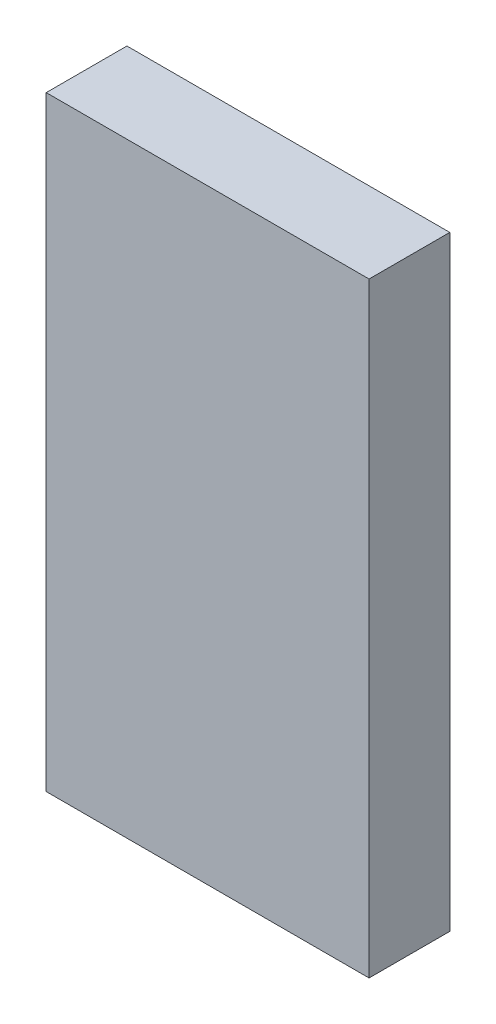
ISO-10303-21;
HEADER;
FILE_DESCRIPTION(('STEP AP214'),'2;1');
FILE_NAME('part.step','',(''),(''),'','','');
FILE_SCHEMA(('AUTOMOTIVE_DESIGN { 1 0 10303 214 1 1 1 1 }'));
ENDSEC;
DATA;
#1=APPLICATION_CONTEXT('core data for automotive mechanical design processes');
#2=APPLICATION_PROTOCOL_DEFINITION('international standard','automotive_design',2000,#1);
#3=PRODUCT_CONTEXT('',#1,'mechanical');
#4=PRODUCT('Part','Part','',(#3));
#5=PRODUCT_RELATED_PRODUCT_CATEGORY('part','',(#4));
#6=PRODUCT_DEFINITION_FORMATION('','',#4);
#7=PRODUCT_DEFINITION_CONTEXT('part definition',#1,'design');
#8=PRODUCT_DEFINITION('design','',#6,#7);
#9=PRODUCT_DEFINITION_SHAPE('','',#8);
#10=(LENGTH_UNIT() NAMED_UNIT(*) SI_UNIT(.MILLI.,.METRE.));
#11=(NAMED_UNIT(*) PLANE_ANGLE_UNIT() SI_UNIT($,.RADIAN.));
#12=(NAMED_UNIT(*) SI_UNIT($,.STERADIAN.) SOLID_ANGLE_UNIT());
#13=UNCERTAINTY_MEASURE_WITH_UNIT(LENGTH_MEASURE(1.E-05),#10,'distance_accuracy_value','');
#14=(GEOMETRIC_REPRESENTATION_CONTEXT(3) GLOBAL_UNCERTAINTY_ASSIGNED_CONTEXT((#13)) GLOBAL_UNIT_ASSIGNED_CONTEXT((#10,
#11,#12)) REPRESENTATION_CONTEXT('',''));
#15=CARTESIAN_POINT('',(0.,0.,0.));
#16=DIRECTION('',(0.,0.,1.));
#17=DIRECTION('',(1.,0.,0.));
#18=AXIS2_PLACEMENT_3D('',#15,#16,#17);
#19=CARTESIAN_POINT('',(4.,-7.5,1.));
#20=DIRECTION('',(-1.,0.,0.));
#21=DIRECTION('',(0.,0.,1.));
#22=AXIS2_PLACEMENT_3D('',#19,#20,#21);
#23=PLANE('',#22);
#24=DIRECTION('',(0.,1.,0.));
#25=VECTOR('',#24,1.);
#26=CARTESIAN_POINT('',(4.,-7.5,-1.));
#27=LINE('',#26,#25);
#28=CARTESIAN_POINT('',(4.,-7.5,-1.));
#29=VERTEX_POINT('',#28);
#30=CARTESIAN_POINT('',(4.,7.5,-1.));
#31=VERTEX_POINT('',#30);
#32=EDGE_CURVE('E111',#29,#31,#27,.T.);
#33=ORIENTED_EDGE('',*,*,#32,.T.);
#34=DIRECTION('',(0.,0.,-1.));
#35=VECTOR('',#34,1.);
#36=CARTESIAN_POINT('',(4.,7.5,1.));
#37=LINE('',#36,#35);
#38=CARTESIAN_POINT('',(4.,7.5,1.));
#39=VERTEX_POINT('',#38);
#40=EDGE_CURVE('E11',#39,#31,#37,.T.);
#41=ORIENTED_EDGE('',*,*,#40,.F.);
#42=DIRECTION('',(0.,1.,0.));
#43=VECTOR('',#42,1.);
#44=CARTESIAN_POINT('',(4.,-7.5,1.));
#45=LINE('',#44,#43);
#46=CARTESIAN_POINT('',(4.,-7.5,1.));
#47=VERTEX_POINT('',#46);
#48=EDGE_CURVE('E95',#47,#39,#45,.T.);
#49=ORIENTED_EDGE('',*,*,#48,.F.);
#50=DIRECTION('',(0.,0.,-1.));
#51=VECTOR('',#50,1.);
#52=CARTESIAN_POINT('',(4.,-7.5,1.));
#53=LINE('',#52,#51);
#54=EDGE_CURVE('E107',#47,#29,#53,.T.);
#55=ORIENTED_EDGE('',*,*,#54,.T.);
#56=EDGE_LOOP('',(#33,#41,#49,#55));
#57=FACE_BOUND('',#56,.T.);
#58=ADVANCED_FACE('F43',(#57),#23,.F.);
#59=CARTESIAN_POINT('',(-4.,7.5,1.));
#60=DIRECTION('',(0.,-1.,0.));
#61=DIRECTION('',(0.,0.,-1.));
#62=AXIS2_PLACEMENT_3D('',#59,#60,#61);
#63=PLANE('',#62);
#64=DIRECTION('',(-1.,0.,0.));
#65=VECTOR('',#64,1.);
#66=CARTESIAN_POINT('',(-4.,7.5,-1.));
#67=LINE('',#66,#65);
#68=CARTESIAN_POINT('',(-4.,7.5,-1.));
#69=VERTEX_POINT('',#68);
#70=EDGE_CURVE('E100',#31,#69,#67,.T.);
#71=ORIENTED_EDGE('',*,*,#70,.T.);
#72=DIRECTION('',(0.,0.,-1.));
#73=VECTOR('',#72,1.);
#74=CARTESIAN_POINT('',(-4.,7.5,1.));
#75=LINE('',#74,#73);
#76=CARTESIAN_POINT('',(-4.,7.5,1.));
#77=VERTEX_POINT('',#76);
#78=EDGE_CURVE('E52',#77,#69,#75,.T.);
#79=ORIENTED_EDGE('',*,*,#78,.F.);
#80=DIRECTION('',(-1.,0.,0.));
#81=VECTOR('',#80,1.);
#82=CARTESIAN_POINT('',(-4.,7.5,1.));
#83=LINE('',#82,#81);
#84=EDGE_CURVE('E90',#39,#77,#83,.T.);
#85=ORIENTED_EDGE('',*,*,#84,.F.);
#86=ORIENTED_EDGE('',*,*,#40,.T.);
#87=EDGE_LOOP('',(#71,#79,#85,#86));
#88=FACE_BOUND('',#87,.T.);
#89=ADVANCED_FACE('F99',(#88),#63,.F.);
#90=CARTESIAN_POINT('',(-4.,-7.5,1.));
#91=DIRECTION('',(1.,0.,0.));
#92=DIRECTION('',(0.,0.,-1.));
#93=AXIS2_PLACEMENT_3D('',#90,#91,#92);
#94=PLANE('',#93);
#95=DIRECTION('',(0.,-1.,0.));
#96=VECTOR('',#95,1.);
#97=CARTESIAN_POINT('',(-4.,-7.5,-1.));
#98=LINE('',#97,#96);
#99=CARTESIAN_POINT('',(-4.,-7.5,-1.));
#100=VERTEX_POINT('',#99);
#101=EDGE_CURVE('E77',#69,#100,#98,.T.);
#102=ORIENTED_EDGE('',*,*,#101,.T.);
#103=DIRECTION('',(0.,0.,-1.));
#104=VECTOR('',#103,1.);
#105=CARTESIAN_POINT('',(-4.,-7.5,1.));
#106=LINE('',#105,#104);
#107=CARTESIAN_POINT('',(-4.,-7.5,1.));
#108=VERTEX_POINT('',#107);
#109=EDGE_CURVE('E102',#108,#100,#106,.T.);
#110=ORIENTED_EDGE('',*,*,#109,.F.);
#111=DIRECTION('',(0.,-1.,0.));
#112=VECTOR('',#111,1.);
#113=CARTESIAN_POINT('',(-4.,-7.5,1.));
#114=LINE('',#113,#112);
#115=EDGE_CURVE('E93',#77,#108,#114,.T.);
#116=ORIENTED_EDGE('',*,*,#115,.F.);
#117=ORIENTED_EDGE('',*,*,#78,.T.);
#118=EDGE_LOOP('',(#102,#110,#116,#117));
#119=FACE_BOUND('',#118,.T.);
#120=ADVANCED_FACE('F103',(#119),#94,.F.);
#121=CARTESIAN_POINT('',(-4.,-7.5,1.));
#122=DIRECTION('',(0.,1.,0.));
#123=DIRECTION('',(0.,0.,1.));
#124=AXIS2_PLACEMENT_3D('',#121,#122,#123);
#125=PLANE('',#124);
#126=DIRECTION('',(1.,0.,0.));
#127=VECTOR('',#126,1.);
#128=CARTESIAN_POINT('',(-4.,-7.5,-1.));
#129=LINE('',#128,#127);
#130=EDGE_CURVE('E83',#100,#29,#129,.T.);
#131=ORIENTED_EDGE('',*,*,#130,.T.);
#132=ORIENTED_EDGE('',*,*,#54,.F.);
#133=DIRECTION('',(1.,0.,0.));
#134=VECTOR('',#133,1.);
#135=CARTESIAN_POINT('',(-4.,-7.5,1.));
#136=LINE('',#135,#134);
#137=EDGE_CURVE('E60',#108,#47,#136,.T.);
#138=ORIENTED_EDGE('',*,*,#137,.F.);
#139=ORIENTED_EDGE('',*,*,#109,.T.);
#140=EDGE_LOOP('',(#131,#132,#138,#139));
#141=FACE_BOUND('',#140,.T.);
#142=ADVANCED_FACE('F125',(#141),#125,.F.);
#143=CARTESIAN_POINT('',(0.,0.,1.));
#144=DIRECTION('',(0.,0.,-1.));
#145=DIRECTION('',(-1.,0.,0.));
#146=AXIS2_PLACEMENT_3D('',#143,#144,#145);
#147=PLANE('',#146);
#148=ORIENTED_EDGE('',*,*,#48,.T.);
#149=ORIENTED_EDGE('',*,*,#84,.T.);
#150=ORIENTED_EDGE('',*,*,#115,.T.);
#151=ORIENTED_EDGE('',*,*,#137,.T.);
#152=EDGE_LOOP('',(#148,#149,#150,#151));
#153=FACE_BOUND('',#152,.T.);
#154=ADVANCED_FACE('F91',(#153),#147,.F.);
#155=CARTESIAN_POINT('',(0.,0.,-1.));
#156=DIRECTION('',(0.,0.,-1.));
#157=DIRECTION('',(-1.,0.,0.));
#158=AXIS2_PLACEMENT_3D('',#155,#156,#157);
#159=PLANE('',#158);
#160=CARTESIAN_POINT('',(0.,6.,-1.));
#161=DIRECTION('',(0.,0.,-1.));
#162=DIRECTION('',(-1.,0.,0.));
#163=AXIS2_PLACEMENT_3D('',#160,#161,#162);
#164=CIRCLE('',#163,1.);
#165=CARTESIAN_POINT('',(-1.,6.,-1.));
#166=VERTEX_POINT('',#165);
#167=EDGE_CURVE('E140',#166,#166,#164,.T.);
#168=ORIENTED_EDGE('',*,*,#167,.F.);
#169=EDGE_LOOP('',(#168));
#170=FACE_BOUND('',#169,.T.);
#171=CARTESIAN_POINT('',(0.,-6.,-1.));
#172=DIRECTION('',(0.,0.,-1.));
#173=DIRECTION('',(1.,0.,0.));
#174=AXIS2_PLACEMENT_3D('',#171,#172,#173);
#175=CIRCLE('',#174,1.);
#176=CARTESIAN_POINT('',(1.,-6.,-1.));
#177=VERTEX_POINT('',#176);
#178=EDGE_CURVE('E136',#177,#177,#175,.T.);
#179=ORIENTED_EDGE('',*,*,#178,.F.);
#180=EDGE_LOOP('',(#179));
#181=FACE_BOUND('',#180,.T.);
#182=ORIENTED_EDGE('',*,*,#32,.F.);
#183=ORIENTED_EDGE('',*,*,#130,.F.);
#184=ORIENTED_EDGE('',*,*,#101,.F.);
#185=ORIENTED_EDGE('',*,*,#70,.F.);
#186=EDGE_LOOP('',(#182,#183,#184,#185));
#187=FACE_BOUND('',#186,.T.);
#188=ADVANCED_FACE('F128',(#170,#181,#187),#159,.T.);
#189=CARTESIAN_POINT('',(0.,-6.,0.));
#190=DIRECTION('',(0.,0.,-1.));
#191=DIRECTION('',(-1.,0.,0.));
#192=AXIS2_PLACEMENT_3D('',#189,#190,#191);
#193=CYLINDRICAL_SURFACE('',#192,1.);
#194=CARTESIAN_POINT('',(0.,-6.,0.));
#195=DIRECTION('',(0.,0.,-1.));
#196=DIRECTION('',(1.,0.,0.));
#197=AXIS2_PLACEMENT_3D('',#194,#195,#196);
#198=CIRCLE('',#197,1.);
#199=CARTESIAN_POINT('',(1.,-6.,0.));
#200=VERTEX_POINT('',#199);
#201=EDGE_CURVE('E132',#200,#200,#198,.T.);
#202=ORIENTED_EDGE('',*,*,#201,.F.);
#203=EDGE_LOOP('',(#202));
#204=FACE_BOUND('',#203,.T.);
#205=ORIENTED_EDGE('',*,*,#178,.T.);
#206=EDGE_LOOP('',(#205));
#207=FACE_BOUND('',#206,.T.);
#208=ADVANCED_FACE('F159',(#204,#207),#193,.F.);
#209=CARTESIAN_POINT('',(0.,-6.,0.));
#210=DIRECTION('',(0.,0.,1.));
#211=DIRECTION('',(1.,0.,0.));
#212=AXIS2_PLACEMENT_3D('',#209,#210,#211);
#213=PLANE('',#212);
#214=ORIENTED_EDGE('',*,*,#201,.T.);
#215=EDGE_LOOP('',(#214));
#216=FACE_BOUND('',#215,.T.);
#217=ADVANCED_FACE('F153',(#216),#213,.F.);
#218=CARTESIAN_POINT('',(0.,6.,0.));
#219=DIRECTION('',(0.,0.,-1.));
#220=DIRECTION('',(-1.,0.,0.));
#221=AXIS2_PLACEMENT_3D('',#218,#219,#220);
#222=CYLINDRICAL_SURFACE('',#221,1.);
#223=CARTESIAN_POINT('',(0.,6.,0.));
#224=DIRECTION('',(0.,0.,-1.));
#225=DIRECTION('',(-1.,0.,0.));
#226=AXIS2_PLACEMENT_3D('',#223,#224,#225);
#227=CIRCLE('',#226,1.);
#228=CARTESIAN_POINT('',(-1.,6.,0.));
#229=VERTEX_POINT('',#228);
#230=EDGE_CURVE('E115',#229,#229,#227,.T.);
#231=ORIENTED_EDGE('',*,*,#230,.F.);
#232=EDGE_LOOP('',(#231));
#233=FACE_BOUND('',#232,.T.);
#234=ORIENTED_EDGE('',*,*,#167,.T.);
#235=EDGE_LOOP('',(#234));
#236=FACE_BOUND('',#235,.T.);
#237=ADVANCED_FACE('F150',(#233,#236),#222,.F.);
#238=CARTESIAN_POINT('',(0.,6.,0.));
#239=DIRECTION('',(0.,0.,-1.));
#240=DIRECTION('',(-1.,0.,0.));
#241=AXIS2_PLACEMENT_3D('',#238,#239,#240);
#242=PLANE('',#241);
#243=ORIENTED_EDGE('',*,*,#230,.T.);
#244=EDGE_LOOP('',(#243));
#245=FACE_BOUND('',#244,.T.);
#246=ADVANCED_FACE('F148',(#245),#242,.T.);
#247=CLOSED_SHELL('',(#58,#89,#120,#142,#154,#188,#208,#217,#237,#246));
#248=MANIFOLD_SOLID_BREP('B2',#247);
#249=ADVANCED_BREP_SHAPE_REPRESENTATION('',(#18,#248),#14);
#250=SHAPE_DEFINITION_REPRESENTATION(#9,#249);
ENDSEC;
END-ISO-10303-21;
